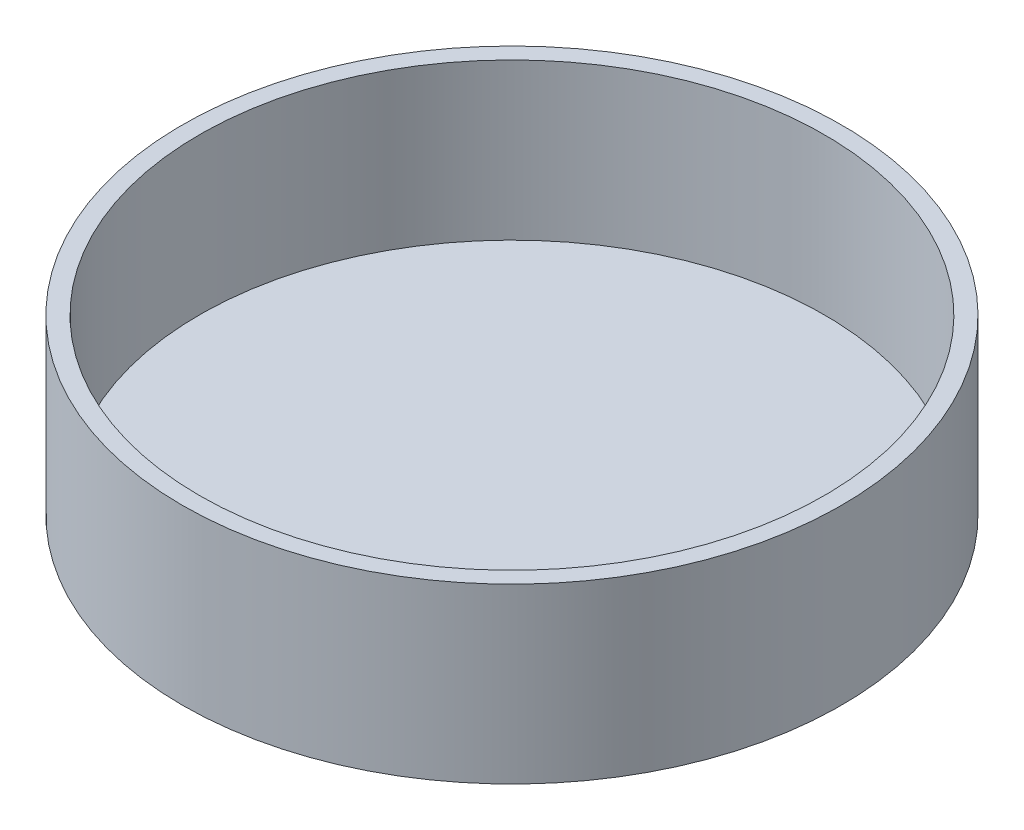
ISO-10303-21;
HEADER;
FILE_DESCRIPTION(('STEP AP214'),'2;1');
FILE_NAME('part.step','',(''),(''),'','','');
FILE_SCHEMA(('AUTOMOTIVE_DESIGN { 1 0 10303 214 1 1 1 1 }'));
ENDSEC;
DATA;
#1=APPLICATION_CONTEXT('core data for automotive mechanical design processes');
#2=APPLICATION_PROTOCOL_DEFINITION('international standard','automotive_design',2000,#1);
#3=PRODUCT_CONTEXT('',#1,'mechanical');
#4=PRODUCT('Part','Part','',(#3));
#5=PRODUCT_RELATED_PRODUCT_CATEGORY('part','',(#4));
#6=PRODUCT_DEFINITION_FORMATION('','',#4);
#7=PRODUCT_DEFINITION_CONTEXT('part definition',#1,'design');
#8=PRODUCT_DEFINITION('design','',#6,#7);
#9=PRODUCT_DEFINITION_SHAPE('','',#8);
#10=(LENGTH_UNIT() NAMED_UNIT(*) SI_UNIT(.MILLI.,.METRE.));
#11=(NAMED_UNIT(*) PLANE_ANGLE_UNIT() SI_UNIT($,.RADIAN.));
#12=(NAMED_UNIT(*) SI_UNIT($,.STERADIAN.) SOLID_ANGLE_UNIT());
#13=UNCERTAINTY_MEASURE_WITH_UNIT(LENGTH_MEASURE(1.E-05),#10,'distance_accuracy_value','');
#14=(GEOMETRIC_REPRESENTATION_CONTEXT(3) GLOBAL_UNCERTAINTY_ASSIGNED_CONTEXT((#13)) GLOBAL_UNIT_ASSIGNED_CONTEXT((#10,
#11,#12)) REPRESENTATION_CONTEXT('',''));
#15=CARTESIAN_POINT('',(0.,0.,0.));
#16=DIRECTION('',(0.,0.,1.));
#17=DIRECTION('',(1.,0.,0.));
#18=AXIS2_PLACEMENT_3D('',#15,#16,#17);
#19=CARTESIAN_POINT('',(0.,0.79375,0.));
#20=DIRECTION('',(0.,-1.,0.));
#21=DIRECTION('',(0.,0.,-1.));
#22=AXIS2_PLACEMENT_3D('',#19,#20,#21);
#23=CYLINDRICAL_SURFACE('',#22,15.3416);
#24=CARTESIAN_POINT('',(0.,0.,0.));
#25=DIRECTION('',(0.,1.,0.));
#26=DIRECTION('',(0.,0.,1.));
#27=AXIS2_PLACEMENT_3D('',#24,#25,#26);
#28=CIRCLE('',#27,15.3416);
#29=CARTESIAN_POINT('',(0.,0.,15.3416));
#30=VERTEX_POINT('',#29);
#31=EDGE_CURVE('E47',#30,#30,#28,.T.);
#32=ORIENTED_EDGE('',*,*,#31,.T.);
#33=EDGE_LOOP('',(#32));
#34=FACE_BOUND('',#33,.T.);
#35=CARTESIAN_POINT('',(0.,8.05815,0.));
#36=DIRECTION('',(0.,1.,0.));
#37=DIRECTION('',(0.,0.,1.));
#38=AXIS2_PLACEMENT_3D('',#35,#36,#37);
#39=CIRCLE('',#38,15.3416);
#40=CARTESIAN_POINT('',(0.,8.05815,15.3416));
#41=VERTEX_POINT('',#40);
#42=EDGE_CURVE('E52',#41,#41,#39,.T.);
#43=ORIENTED_EDGE('',*,*,#42,.F.);
#44=EDGE_LOOP('',(#43));
#45=FACE_BOUND('',#44,.T.);
#46=ADVANCED_FACE('F40',(#34,#45),#23,.T.);
#47=CARTESIAN_POINT('',(0.,0.,0.));
#48=DIRECTION('',(0.,1.,0.));
#49=DIRECTION('',(0.,0.,1.));
#50=AXIS2_PLACEMENT_3D('',#47,#48,#49);
#51=PLANE('',#50);
#52=ORIENTED_EDGE('',*,*,#31,.F.);
#53=EDGE_LOOP('',(#52));
#54=FACE_BOUND('',#53,.T.);
#55=ADVANCED_FACE('F68',(#54),#51,.F.);
#56=CARTESIAN_POINT('',(0.,8.05815,0.));
#57=DIRECTION('',(0.,1.,0.));
#58=DIRECTION('',(0.,0.,1.));
#59=AXIS2_PLACEMENT_3D('',#56,#57,#58);
#60=PLANE('',#59);
#61=ORIENTED_EDGE('',*,*,#42,.T.);
#62=EDGE_LOOP('',(#61));
#63=FACE_BOUND('',#62,.T.);
#64=CARTESIAN_POINT('',(0.,8.05815,0.));
#65=DIRECTION('',(0.,1.,0.));
#66=DIRECTION('',(0.,0.,1.));
#67=AXIS2_PLACEMENT_3D('',#64,#65,#66);
#68=CIRCLE('',#67,14.54785);
#69=CARTESIAN_POINT('',(0.,8.05815,14.54785));
#70=VERTEX_POINT('',#69);
#71=EDGE_CURVE('E57',#70,#70,#68,.T.);
#72=ORIENTED_EDGE('',*,*,#71,.F.);
#73=EDGE_LOOP('',(#72));
#74=FACE_BOUND('',#73,.T.);
#75=ADVANCED_FACE('F66',(#63,#74),#60,.T.);
#76=CARTESIAN_POINT('',(0.,8.05815,0.));
#77=DIRECTION('',(0.,-1.,0.));
#78=DIRECTION('',(0.,0.,-1.));
#79=AXIS2_PLACEMENT_3D('',#76,#77,#78);
#80=CYLINDRICAL_SURFACE('',#79,14.54785);
#81=ORIENTED_EDGE('',*,*,#71,.T.);
#82=EDGE_LOOP('',(#81));
#83=FACE_BOUND('',#82,.T.);
#84=CARTESIAN_POINT('',(0.,0.79375,0.));
#85=DIRECTION('',(0.,1.,0.));
#86=DIRECTION('',(0.,0.,1.));
#87=AXIS2_PLACEMENT_3D('',#84,#85,#86);
#88=CIRCLE('',#87,14.54785);
#89=CARTESIAN_POINT('',(0.,0.79375,14.54785));
#90=VERTEX_POINT('',#89);
#91=EDGE_CURVE('E10',#90,#90,#88,.F.);
#92=ORIENTED_EDGE('',*,*,#91,.T.);
#93=EDGE_LOOP('',(#92));
#94=FACE_BOUND('',#93,.T.);
#95=ADVANCED_FACE('F64',(#83,#94),#80,.F.);
#96=CARTESIAN_POINT('',(0.,0.79375,0.));
#97=DIRECTION('',(0.,1.,0.));
#98=DIRECTION('',(0.,0.,1.));
#99=AXIS2_PLACEMENT_3D('',#96,#97,#98);
#100=PLANE('',#99);
#101=ORIENTED_EDGE('',*,*,#91,.F.);
#102=EDGE_LOOP('',(#101));
#103=FACE_BOUND('',#102,.T.);
#104=ADVANCED_FACE('F75',(#103),#100,.T.);
#105=CLOSED_SHELL('',(#46,#55,#75,#95,#104));
#106=MANIFOLD_SOLID_BREP('B2',#105);
#107=ADVANCED_BREP_SHAPE_REPRESENTATION('',(#18,#106),#14);
#108=SHAPE_DEFINITION_REPRESENTATION(#9,#107);
ENDSEC;
END-ISO-10303-21;
